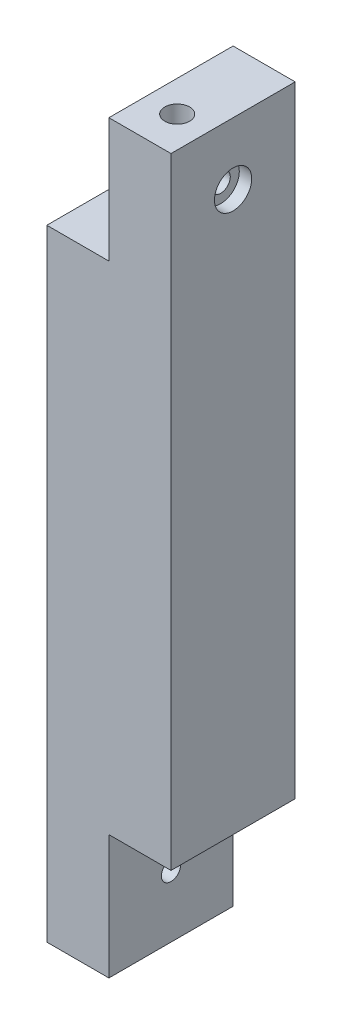
ISO-10303-21;
HEADER;
FILE_DESCRIPTION(('STEP AP214'),'2;1');
FILE_NAME('part.step','',(''),(''),'','','');
FILE_SCHEMA(('AUTOMOTIVE_DESIGN { 1 0 10303 214 1 1 1 1 }'));
ENDSEC;
DATA;
#1=APPLICATION_CONTEXT('core data for automotive mechanical design processes');
#2=APPLICATION_PROTOCOL_DEFINITION('international standard','automotive_design',2000,#1);
#3=PRODUCT_CONTEXT('',#1,'mechanical');
#4=PRODUCT('Part','Part','',(#3));
#5=PRODUCT_RELATED_PRODUCT_CATEGORY('part','',(#4));
#6=PRODUCT_DEFINITION_FORMATION('','',#4);
#7=PRODUCT_DEFINITION_CONTEXT('part definition',#1,'design');
#8=PRODUCT_DEFINITION('design','',#6,#7);
#9=PRODUCT_DEFINITION_SHAPE('','',#8);
#10=(LENGTH_UNIT() NAMED_UNIT(*) SI_UNIT(.MILLI.,.METRE.));
#11=(NAMED_UNIT(*) PLANE_ANGLE_UNIT() SI_UNIT($,.RADIAN.));
#12=(NAMED_UNIT(*) SI_UNIT($,.STERADIAN.) SOLID_ANGLE_UNIT());
#13=UNCERTAINTY_MEASURE_WITH_UNIT(LENGTH_MEASURE(1.E-05),#10,'distance_accuracy_value','');
#14=(GEOMETRIC_REPRESENTATION_CONTEXT(3) GLOBAL_UNCERTAINTY_ASSIGNED_CONTEXT((#13)) GLOBAL_UNIT_ASSIGNED_CONTEXT((#10,
#11,#12)) REPRESENTATION_CONTEXT('',''));
#15=CARTESIAN_POINT('',(0.,0.,0.));
#16=DIRECTION('',(0.,0.,1.));
#17=DIRECTION('',(1.,0.,0.));
#18=AXIS2_PLACEMENT_3D('',#15,#16,#17);
#19=CARTESIAN_POINT('',(-27.9813215779807,10.,6.45386967852447));
#20=DIRECTION('',(1.,0.,0.));
#21=DIRECTION('',(0.,0.,-1.));
#22=AXIS2_PLACEMENT_3D('',#19,#20,#21);
#23=CYLINDRICAL_SURFACE('',#22,1.55);
#24=CARTESIAN_POINT('',(-7.98132157798069,10.,6.45386967852447));
#25=DIRECTION('',(1.,0.,0.));
#26=DIRECTION('',(0.,0.,-1.));
#27=AXIS2_PLACEMENT_3D('',#24,#25,#26);
#28=CIRCLE('',#27,1.55);
#29=CARTESIAN_POINT('',(-7.98132157798069,10.,4.90386967852447));
#30=VERTEX_POINT('',#29);
#31=EDGE_CURVE('E218',#30,#30,#28,.T.);
#32=ORIENTED_EDGE('',*,*,#31,.T.);
#33=EDGE_LOOP('',(#32));
#34=FACE_BOUND('',#33,.T.);
#35=CARTESIAN_POINT('',(-15.9813215779807,10.,6.45386967852447));
#36=DIRECTION('',(-1.,0.,0.));
#37=DIRECTION('',(0.,0.,1.));
#38=AXIS2_PLACEMENT_3D('',#35,#36,#37);
#39=CIRCLE('',#38,1.55);
#40=CARTESIAN_POINT('',(-15.9813215779807,10.,8.00386967852447));
#41=VERTEX_POINT('',#40);
#42=EDGE_CURVE('E54',#41,#41,#39,.F.);
#43=ORIENTED_EDGE('',*,*,#42,.F.);
#44=EDGE_LOOP('',(#43));
#45=FACE_BOUND('',#44,.T.);
#46=ADVANCED_FACE('F50',(#34,#45),#23,.F.);
#47=CARTESIAN_POINT('',(112.018678422019,110.,6.45386967852447));
#48=DIRECTION('',(-1.,0.,0.));
#49=DIRECTION('',(0.,-1.,0.));
#50=AXIS2_PLACEMENT_3D('',#47,#48,#49);
#51=CYLINDRICAL_SURFACE('',#50,1.55);
#52=CARTESIAN_POINT('',(-7.98132157798068,110.,6.45386967852447));
#53=DIRECTION('',(-1.,0.,0.));
#54=DIRECTION('',(0.,-1.,0.));
#55=AXIS2_PLACEMENT_3D('',#52,#53,#54);
#56=CIRCLE('',#55,1.55);
#57=CARTESIAN_POINT('',(-7.98132157798068,108.45,6.45386967852447));
#58=VERTEX_POINT('',#57);
#59=EDGE_CURVE('E133',#58,#58,#56,.T.);
#60=ORIENTED_EDGE('',*,*,#59,.T.);
#61=EDGE_LOOP('',(#60));
#62=FACE_BOUND('',#61,.T.);
#63=CARTESIAN_POINT('',(0.0186784220193165,110.,6.45386967852447));
#64=DIRECTION('',(1.,0.,0.));
#65=DIRECTION('',(0.,0.,-1.));
#66=AXIS2_PLACEMENT_3D('',#63,#64,#65);
#67=CIRCLE('',#66,1.55);
#68=CARTESIAN_POINT('',(0.0186784220193162,110.,4.90386967852447));
#69=VERTEX_POINT('',#68);
#70=EDGE_CURVE('E202',#69,#69,#67,.F.);
#71=ORIENTED_EDGE('',*,*,#70,.F.);
#72=EDGE_LOOP('',(#71));
#73=FACE_BOUND('',#72,.T.);
#74=ADVANCED_FACE('F265',(#62,#73),#51,.F.);
#75=CARTESIAN_POINT('',(0.,0.,0.));
#76=DIRECTION('',(0.,-1.,0.));
#77=DIRECTION('',(0.,0.,-1.));
#78=AXIS2_PLACEMENT_3D('',#75,#76,#77);
#79=PLANE('',#78);
#80=DIRECTION('',(1.,0.,0.));
#81=VECTOR('',#80,1.);
#82=CARTESIAN_POINT('',(-17.9813215779807,0.,-3.54613032147553));
#83=LINE('',#82,#81);
#84=CARTESIAN_POINT('',(-17.9813215779807,0.,-3.54613032147553));
#85=VERTEX_POINT('',#84);
#86=CARTESIAN_POINT('',(-7.98132157798069,0.,-3.54613032147554));
#87=VERTEX_POINT('',#86);
#88=EDGE_CURVE('E179',#85,#87,#83,.T.);
#89=ORIENTED_EDGE('',*,*,#88,.T.);
#90=DIRECTION('',(0.,0.,1.));
#91=VECTOR('',#90,1.);
#92=CARTESIAN_POINT('',(-7.98132157798069,0.,0.));
#93=LINE('',#92,#91);
#94=CARTESIAN_POINT('',(-7.98132157798069,0.,16.4538696785245));
#95=VERTEX_POINT('',#94);
#96=EDGE_CURVE('E60',#87,#95,#93,.T.);
#97=ORIENTED_EDGE('',*,*,#96,.T.);
#98=DIRECTION('',(1.,0.,0.));
#99=VECTOR('',#98,1.);
#100=CARTESIAN_POINT('',(-17.9813215779807,0.,16.4538696785245));
#101=LINE('',#100,#99);
#102=CARTESIAN_POINT('',(-17.9813215779807,0.,16.4538696785245));
#103=VERTEX_POINT('',#102);
#104=EDGE_CURVE('E137',#103,#95,#101,.T.);
#105=ORIENTED_EDGE('',*,*,#104,.F.);
#106=DIRECTION('',(0.,0.,1.));
#107=VECTOR('',#106,1.);
#108=CARTESIAN_POINT('',(-17.9813215779807,0.,-3.54613032147553));
#109=LINE('',#108,#107);
#110=EDGE_CURVE('E169',#85,#103,#109,.T.);
#111=ORIENTED_EDGE('',*,*,#110,.F.);
#112=EDGE_LOOP('',(#89,#97,#105,#111));
#113=FACE_BOUND('',#112,.T.);
#114=ADVANCED_FACE('F271',(#113),#79,.T.);
#115=CARTESIAN_POINT('',(0.,120.,0.));
#116=DIRECTION('',(0.,-1.,0.));
#117=DIRECTION('',(0.,0.,-1.));
#118=AXIS2_PLACEMENT_3D('',#115,#116,#117);
#119=PLANE('',#118);
#120=CARTESIAN_POINT('',(-2.98132157798069,120.,10.4538696785245));
#121=DIRECTION('',(0.,-1.,0.));
#122=DIRECTION('',(0.,0.,-1.));
#123=AXIS2_PLACEMENT_3D('',#120,#121,#122);
#124=CIRCLE('',#123,2.);
#125=CARTESIAN_POINT('',(-2.98132157798069,120.,8.45386967852447));
#126=VERTEX_POINT('',#125);
#127=EDGE_CURVE('E229',#126,#126,#124,.T.);
#128=ORIENTED_EDGE('',*,*,#127,.T.);
#129=EDGE_LOOP('',(#128));
#130=FACE_BOUND('',#129,.T.);
#131=DIRECTION('',(0.,0.,-1.));
#132=VECTOR('',#131,1.);
#133=CARTESIAN_POINT('',(-7.98132157798069,120.,0.));
#134=LINE('',#133,#132);
#135=CARTESIAN_POINT('',(-7.98132157798068,120.,16.4538696785245));
#136=VERTEX_POINT('',#135);
#137=CARTESIAN_POINT('',(-7.98132157798069,120.,-3.54613032147554));
#138=VERTEX_POINT('',#137);
#139=EDGE_CURVE('E198',#136,#138,#134,.T.);
#140=ORIENTED_EDGE('',*,*,#139,.F.);
#141=DIRECTION('',(1.,0.,0.));
#142=VECTOR('',#141,1.);
#143=CARTESIAN_POINT('',(-17.9813215779807,120.,16.4538696785245));
#144=LINE('',#143,#142);
#145=CARTESIAN_POINT('',(2.01867842201931,120.,16.4538696785245));
#146=VERTEX_POINT('',#145);
#147=EDGE_CURVE('E165',#136,#146,#144,.T.);
#148=ORIENTED_EDGE('',*,*,#147,.T.);
#149=DIRECTION('',(0.,0.,1.));
#150=VECTOR('',#149,1.);
#151=CARTESIAN_POINT('',(2.01867842201931,120.,-3.54613032147553));
#152=LINE('',#151,#150);
#153=CARTESIAN_POINT('',(2.01867842201931,120.,-3.54613032147553));
#154=VERTEX_POINT('',#153);
#155=EDGE_CURVE('E168',#154,#146,#152,.T.);
#156=ORIENTED_EDGE('',*,*,#155,.F.);
#157=DIRECTION('',(1.,0.,0.));
#158=VECTOR('',#157,1.);
#159=CARTESIAN_POINT('',(-17.9813215779807,120.,-3.54613032147553));
#160=LINE('',#159,#158);
#161=EDGE_CURVE('E173',#138,#154,#160,.T.);
#162=ORIENTED_EDGE('',*,*,#161,.F.);
#163=EDGE_LOOP('',(#140,#148,#156,#162));
#164=FACE_BOUND('',#163,.T.);
#165=ADVANCED_FACE('F241',(#130,#164),#119,.F.);
#166=CARTESIAN_POINT('',(-17.9813215779807,120.,16.4538696785245));
#167=DIRECTION('',(0.,0.,-1.));
#168=DIRECTION('',(-1.,0.,0.));
#169=AXIS2_PLACEMENT_3D('',#166,#167,#168);
#170=PLANE('',#169);
#171=DIRECTION('',(0.,1.,0.));
#172=VECTOR('',#171,1.);
#173=CARTESIAN_POINT('',(-7.98132157798069,0.,16.4538696785245));
#174=LINE('',#173,#172);
#175=CARTESIAN_POINT('',(-7.98132157798069,20.,16.4538696785245));
#176=VERTEX_POINT('',#175);
#177=EDGE_CURVE('E68',#95,#176,#174,.T.);
#178=ORIENTED_EDGE('',*,*,#177,.T.);
#179=DIRECTION('',(-1.,0.,0.));
#180=VECTOR('',#179,1.);
#181=CARTESIAN_POINT('',(2.01867842201931,20.,16.4538696785245));
#182=LINE('',#181,#180);
#183=CARTESIAN_POINT('',(2.01867842201931,20.,16.4538696785245));
#184=VERTEX_POINT('',#183);
#185=EDGE_CURVE('E126',#184,#176,#182,.T.);
#186=ORIENTED_EDGE('',*,*,#185,.F.);
#187=DIRECTION('',(0.,-1.,0.));
#188=VECTOR('',#187,1.);
#189=CARTESIAN_POINT('',(2.01867842201931,120.,16.4538696785245));
#190=LINE('',#189,#188);
#191=EDGE_CURVE('E195',#146,#184,#190,.T.);
#192=ORIENTED_EDGE('',*,*,#191,.F.);
#193=ORIENTED_EDGE('',*,*,#147,.F.);
#194=DIRECTION('',(0.,-1.,0.));
#195=VECTOR('',#194,1.);
#196=CARTESIAN_POINT('',(-7.98132157798069,120.,16.4538696785245));
#197=LINE('',#196,#195);
#198=CARTESIAN_POINT('',(-7.98132157798068,100.,16.4538696785245));
#199=VERTEX_POINT('',#198);
#200=EDGE_CURVE('E76',#136,#199,#197,.T.);
#201=ORIENTED_EDGE('',*,*,#200,.T.);
#202=DIRECTION('',(1.,0.,0.));
#203=VECTOR('',#202,1.);
#204=CARTESIAN_POINT('',(-17.9813215779807,100.,16.4538696785245));
#205=LINE('',#204,#203);
#206=CARTESIAN_POINT('',(-17.9813215779807,100.,16.4538696785245));
#207=VERTEX_POINT('',#206);
#208=EDGE_CURVE('E146',#207,#199,#205,.T.);
#209=ORIENTED_EDGE('',*,*,#208,.F.);
#210=DIRECTION('',(0.,-1.,0.));
#211=VECTOR('',#210,1.);
#212=CARTESIAN_POINT('',(-17.9813215779807,120.,16.4538696785245));
#213=LINE('',#212,#211);
#214=EDGE_CURVE('E176',#207,#103,#213,.T.);
#215=ORIENTED_EDGE('',*,*,#214,.T.);
#216=ORIENTED_EDGE('',*,*,#104,.T.);
#217=EDGE_LOOP('',(#178,#186,#192,#193,#201,#209,#215,#216));
#218=FACE_BOUND('',#217,.T.);
#219=ADVANCED_FACE('F52',(#218),#170,.F.);
#220=CARTESIAN_POINT('',(2.01867842201931,120.,-3.54613032147553));
#221=DIRECTION('',(1.,0.,0.));
#222=DIRECTION('',(0.,0.,-1.));
#223=AXIS2_PLACEMENT_3D('',#220,#221,#222);
#224=PLANE('',#223);
#225=CARTESIAN_POINT('',(2.01867842201931,110.,6.45386967852447));
#226=DIRECTION('',(1.,0.,0.));
#227=DIRECTION('',(0.,0.,-1.));
#228=AXIS2_PLACEMENT_3D('',#225,#226,#227);
#229=CIRCLE('',#228,3.);
#230=CARTESIAN_POINT('',(2.01867842201931,110.,3.45386967852447));
#231=VERTEX_POINT('',#230);
#232=EDGE_CURVE('E212',#231,#231,#229,.T.);
#233=ORIENTED_EDGE('',*,*,#232,.F.);
#234=EDGE_LOOP('',(#233));
#235=FACE_BOUND('',#234,.T.);
#236=DIRECTION('',(0.,0.,1.));
#237=VECTOR('',#236,1.);
#238=CARTESIAN_POINT('',(2.01867842201931,20.,-103.546130321476));
#239=LINE('',#238,#237);
#240=CARTESIAN_POINT('',(2.01867842201931,20.,-3.54613032147554));
#241=VERTEX_POINT('',#240);
#242=EDGE_CURVE('E123',#241,#184,#239,.T.);
#243=ORIENTED_EDGE('',*,*,#242,.F.);
#244=DIRECTION('',(0.,-1.,0.));
#245=VECTOR('',#244,1.);
#246=CARTESIAN_POINT('',(2.01867842201931,120.,-3.54613032147553));
#247=LINE('',#246,#245);
#248=EDGE_CURVE('E191',#154,#241,#247,.T.);
#249=ORIENTED_EDGE('',*,*,#248,.F.);
#250=ORIENTED_EDGE('',*,*,#155,.T.);
#251=ORIENTED_EDGE('',*,*,#191,.T.);
#252=EDGE_LOOP('',(#243,#249,#250,#251));
#253=FACE_BOUND('',#252,.T.);
#254=ADVANCED_FACE('F291',(#235,#253),#224,.T.);
#255=CARTESIAN_POINT('',(-17.9813215779807,120.,-3.54613032147553));
#256=DIRECTION('',(0.,0.,-1.));
#257=DIRECTION('',(-1.,0.,0.));
#258=AXIS2_PLACEMENT_3D('',#255,#256,#257);
#259=PLANE('',#258);
#260=DIRECTION('',(1.,0.,0.));
#261=VECTOR('',#260,1.);
#262=CARTESIAN_POINT('',(-17.9813215779807,20.,-3.54613032147553));
#263=LINE('',#262,#261);
#264=CARTESIAN_POINT('',(-7.98132157798069,20.,-3.54613032147554));
#265=VERTEX_POINT('',#264);
#266=EDGE_CURVE('E12',#265,#241,#263,.T.);
#267=ORIENTED_EDGE('',*,*,#266,.F.);
#268=DIRECTION('',(0.,-1.,0.));
#269=VECTOR('',#268,1.);
#270=CARTESIAN_POINT('',(-7.98132157798069,120.,-3.54613032147553));
#271=LINE('',#270,#269);
#272=EDGE_CURVE('E119',#265,#87,#271,.T.);
#273=ORIENTED_EDGE('',*,*,#272,.T.);
#274=ORIENTED_EDGE('',*,*,#88,.F.);
#275=DIRECTION('',(0.,-1.,0.));
#276=VECTOR('',#275,1.);
#277=CARTESIAN_POINT('',(-17.9813215779807,120.,-3.54613032147553));
#278=LINE('',#277,#276);
#279=CARTESIAN_POINT('',(-17.9813215779807,100.,-3.54613032147554));
#280=VERTEX_POINT('',#279);
#281=EDGE_CURVE('E188',#280,#85,#278,.T.);
#282=ORIENTED_EDGE('',*,*,#281,.F.);
#283=DIRECTION('',(-1.,0.,0.));
#284=VECTOR('',#283,1.);
#285=CARTESIAN_POINT('',(-17.9813215779807,100.,-3.54613032147553));
#286=LINE('',#285,#284);
#287=CARTESIAN_POINT('',(-7.98132157798068,100.,-3.54613032147554));
#288=VERTEX_POINT('',#287);
#289=EDGE_CURVE('E162',#288,#280,#286,.T.);
#290=ORIENTED_EDGE('',*,*,#289,.F.);
#291=DIRECTION('',(0.,1.,0.));
#292=VECTOR('',#291,1.);
#293=CARTESIAN_POINT('',(-7.98132157798069,120.,-3.54613032147553));
#294=LINE('',#293,#292);
#295=EDGE_CURVE('E156',#288,#138,#294,.T.);
#296=ORIENTED_EDGE('',*,*,#295,.T.);
#297=ORIENTED_EDGE('',*,*,#161,.T.);
#298=ORIENTED_EDGE('',*,*,#248,.T.);
#299=EDGE_LOOP('',(#267,#273,#274,#282,#290,#296,#297,#298));
#300=FACE_BOUND('',#299,.T.);
#301=ADVANCED_FACE('F294',(#300),#259,.T.);
#302=CARTESIAN_POINT('',(-17.9813215779807,120.,-3.54613032147553));
#303=DIRECTION('',(1.,0.,0.));
#304=DIRECTION('',(0.,0.,-1.));
#305=AXIS2_PLACEMENT_3D('',#302,#303,#304);
#306=PLANE('',#305);
#307=CARTESIAN_POINT('',(-17.9813215779807,10.,6.45386967852447));
#308=DIRECTION('',(-1.,0.,0.));
#309=DIRECTION('',(0.,0.,1.));
#310=AXIS2_PLACEMENT_3D('',#307,#308,#309);
#311=CIRCLE('',#310,3.);
#312=CARTESIAN_POINT('',(-17.9813215779807,10.,9.45386967852447));
#313=VERTEX_POINT('',#312);
#314=EDGE_CURVE('E224',#313,#313,#311,.T.);
#315=ORIENTED_EDGE('',*,*,#314,.F.);
#316=EDGE_LOOP('',(#315));
#317=FACE_BOUND('',#316,.T.);
#318=ORIENTED_EDGE('',*,*,#214,.F.);
#319=DIRECTION('',(0.,0.,1.));
#320=VECTOR('',#319,1.);
#321=CARTESIAN_POINT('',(-17.9813215779807,100.,-103.546130321476));
#322=LINE('',#321,#320);
#323=EDGE_CURVE('E153',#280,#207,#322,.T.);
#324=ORIENTED_EDGE('',*,*,#323,.F.);
#325=ORIENTED_EDGE('',*,*,#281,.T.);
#326=ORIENTED_EDGE('',*,*,#110,.T.);
#327=EDGE_LOOP('',(#318,#324,#325,#326));
#328=FACE_BOUND('',#327,.T.);
#329=ADVANCED_FACE('F307',(#317,#328),#306,.F.);
#330=CARTESIAN_POINT('',(-17.9813215779807,100.,-103.546130321476));
#331=DIRECTION('',(0.,-1.,0.));
#332=DIRECTION('',(0.,0.,-1.));
#333=AXIS2_PLACEMENT_3D('',#330,#331,#332);
#334=PLANE('',#333);
#335=ORIENTED_EDGE('',*,*,#289,.T.);
#336=ORIENTED_EDGE('',*,*,#323,.T.);
#337=ORIENTED_EDGE('',*,*,#208,.T.);
#338=DIRECTION('',(0.,0.,1.));
#339=VECTOR('',#338,1.);
#340=CARTESIAN_POINT('',(-7.98132157798068,100.,-103.546130321476));
#341=LINE('',#340,#339);
#342=EDGE_CURVE('E152',#288,#199,#341,.T.);
#343=ORIENTED_EDGE('',*,*,#342,.F.);
#344=EDGE_LOOP('',(#335,#336,#337,#343));
#345=FACE_BOUND('',#344,.T.);
#346=ADVANCED_FACE('F261',(#345),#334,.F.);
#347=CARTESIAN_POINT('',(-7.98132157798069,120.,-103.546130321476));
#348=DIRECTION('',(-1.,0.,0.));
#349=DIRECTION('',(0.,-1.,0.));
#350=AXIS2_PLACEMENT_3D('',#347,#348,#349);
#351=PLANE('',#350);
#352=ORIENTED_EDGE('',*,*,#59,.F.);
#353=EDGE_LOOP('',(#352));
#354=FACE_BOUND('',#353,.T.);
#355=ORIENTED_EDGE('',*,*,#342,.T.);
#356=ORIENTED_EDGE('',*,*,#200,.F.);
#357=ORIENTED_EDGE('',*,*,#139,.T.);
#358=ORIENTED_EDGE('',*,*,#295,.F.);
#359=EDGE_LOOP('',(#355,#356,#357,#358));
#360=FACE_BOUND('',#359,.T.);
#361=ADVANCED_FACE('F252',(#354,#360),#351,.T.);
#362=CARTESIAN_POINT('',(2.01867842201931,20.,-103.546130321476));
#363=DIRECTION('',(0.,1.,0.));
#364=DIRECTION('',(0.,0.,1.));
#365=AXIS2_PLACEMENT_3D('',#362,#363,#364);
#366=PLANE('',#365);
#367=CARTESIAN_POINT('',(-2.98132157798069,20.,10.4538696785245));
#368=DIRECTION('',(0.,-1.,0.));
#369=DIRECTION('',(0.,0.,-1.));
#370=AXIS2_PLACEMENT_3D('',#367,#368,#369);
#371=CIRCLE('',#370,2.);
#372=CARTESIAN_POINT('',(-2.98132157798069,20.,8.45386967852447));
#373=VERTEX_POINT('',#372);
#374=EDGE_CURVE('E233',#373,#373,#371,.T.);
#375=ORIENTED_EDGE('',*,*,#374,.F.);
#376=EDGE_LOOP('',(#375));
#377=FACE_BOUND('',#376,.T.);
#378=ORIENTED_EDGE('',*,*,#266,.T.);
#379=ORIENTED_EDGE('',*,*,#242,.T.);
#380=ORIENTED_EDGE('',*,*,#185,.T.);
#381=DIRECTION('',(0.,0.,1.));
#382=VECTOR('',#381,1.);
#383=CARTESIAN_POINT('',(-7.98132157798069,20.,-103.546130321476));
#384=LINE('',#383,#382);
#385=EDGE_CURVE('E115',#265,#176,#384,.T.);
#386=ORIENTED_EDGE('',*,*,#385,.F.);
#387=EDGE_LOOP('',(#378,#379,#380,#386));
#388=FACE_BOUND('',#387,.T.);
#389=ADVANCED_FACE('F127',(#377,#388),#366,.F.);
#390=CARTESIAN_POINT('',(-7.98132157798069,0.,-103.546130321476));
#391=DIRECTION('',(1.,0.,0.));
#392=DIRECTION('',(0.,0.,-1.));
#393=AXIS2_PLACEMENT_3D('',#390,#391,#392);
#394=PLANE('',#393);
#395=ORIENTED_EDGE('',*,*,#31,.F.);
#396=EDGE_LOOP('',(#395));
#397=FACE_BOUND('',#396,.T.);
#398=ORIENTED_EDGE('',*,*,#385,.T.);
#399=ORIENTED_EDGE('',*,*,#177,.F.);
#400=ORIENTED_EDGE('',*,*,#96,.F.);
#401=ORIENTED_EDGE('',*,*,#272,.F.);
#402=EDGE_LOOP('',(#398,#399,#400,#401));
#403=FACE_BOUND('',#402,.T.);
#404=ADVANCED_FACE('F117',(#397,#403),#394,.T.);
#405=CARTESIAN_POINT('',(0.018678422019313,110.,6.45386967852447));
#406=DIRECTION('',(1.,0.,0.));
#407=DIRECTION('',(0.,0.,-1.));
#408=AXIS2_PLACEMENT_3D('',#405,#406,#407);
#409=PLANE('',#408);
#410=CARTESIAN_POINT('',(0.018678422019313,110.,6.45386967852447));
#411=DIRECTION('',(1.,0.,0.));
#412=DIRECTION('',(0.,0.,-1.));
#413=AXIS2_PLACEMENT_3D('',#410,#411,#412);
#414=CIRCLE('',#413,3.);
#415=CARTESIAN_POINT('',(0.0186784220193125,110.,3.45386967852447));
#416=VERTEX_POINT('',#415);
#417=EDGE_CURVE('E205',#416,#416,#414,.T.);
#418=ORIENTED_EDGE('',*,*,#417,.T.);
#419=EDGE_LOOP('',(#418));
#420=FACE_BOUND('',#419,.T.);
#421=ORIENTED_EDGE('',*,*,#70,.T.);
#422=EDGE_LOOP('',(#421));
#423=FACE_BOUND('',#422,.T.);
#424=ADVANCED_FACE('F258',(#420,#423),#409,.T.);
#425=CARTESIAN_POINT('',(0.018678422019313,110.,6.45386967852447));
#426=DIRECTION('',(1.,0.,0.));
#427=DIRECTION('',(0.,0.,-1.));
#428=AXIS2_PLACEMENT_3D('',#425,#426,#427);
#429=CYLINDRICAL_SURFACE('',#428,3.);
#430=ORIENTED_EDGE('',*,*,#417,.F.);
#431=EDGE_LOOP('',(#430));
#432=FACE_BOUND('',#431,.T.);
#433=ORIENTED_EDGE('',*,*,#232,.T.);
#434=EDGE_LOOP('',(#433));
#435=FACE_BOUND('',#434,.T.);
#436=ADVANCED_FACE('F280',(#432,#435),#429,.F.);
#437=CARTESIAN_POINT('',(-15.9813215779807,10.,6.45386967852447));
#438=DIRECTION('',(-1.,0.,0.));
#439=DIRECTION('',(0.,0.,1.));
#440=AXIS2_PLACEMENT_3D('',#437,#438,#439);
#441=PLANE('',#440);
#442=CARTESIAN_POINT('',(-15.9813215779807,10.,6.45386967852447));
#443=DIRECTION('',(-1.,0.,0.));
#444=DIRECTION('',(0.,0.,1.));
#445=AXIS2_PLACEMENT_3D('',#442,#443,#444);
#446=CIRCLE('',#445,3.);
#447=CARTESIAN_POINT('',(-15.9813215779807,10.,9.45386967852447));
#448=VERTEX_POINT('',#447);
#449=EDGE_CURVE('E228',#448,#448,#446,.T.);
#450=ORIENTED_EDGE('',*,*,#449,.T.);
#451=EDGE_LOOP('',(#450));
#452=FACE_BOUND('',#451,.T.);
#453=ORIENTED_EDGE('',*,*,#42,.T.);
#454=EDGE_LOOP('',(#453));
#455=FACE_BOUND('',#454,.T.);
#456=ADVANCED_FACE('F282',(#452,#455),#441,.T.);
#457=CARTESIAN_POINT('',(-15.9813215779807,10.,6.45386967852447));
#458=DIRECTION('',(-1.,0.,0.));
#459=DIRECTION('',(0.,0.,1.));
#460=AXIS2_PLACEMENT_3D('',#457,#458,#459);
#461=CYLINDRICAL_SURFACE('',#460,3.);
#462=ORIENTED_EDGE('',*,*,#449,.F.);
#463=EDGE_LOOP('',(#462));
#464=FACE_BOUND('',#463,.T.);
#465=ORIENTED_EDGE('',*,*,#314,.T.);
#466=EDGE_LOOP('',(#465));
#467=FACE_BOUND('',#466,.T.);
#468=ADVANCED_FACE('F247',(#464,#467),#461,.F.);
#469=CARTESIAN_POINT('',(-2.98132157798069,120.,10.4538696785245));
#470=DIRECTION('',(0.,-1.,0.));
#471=DIRECTION('',(0.,0.,-1.));
#472=AXIS2_PLACEMENT_3D('',#469,#470,#471);
#473=CYLINDRICAL_SURFACE('',#472,2.);
#474=ORIENTED_EDGE('',*,*,#127,.F.);
#475=EDGE_LOOP('',(#474));
#476=FACE_BOUND('',#475,.T.);
#477=ORIENTED_EDGE('',*,*,#374,.T.);
#478=EDGE_LOOP('',(#477));
#479=FACE_BOUND('',#478,.T.);
#480=ADVANCED_FACE('F244',(#476,#479),#473,.F.);
#481=CLOSED_SHELL('',(#46,#74,#114,#165,#219,#254,#301,#329,#346,#361,#389,#404,#424,#436,#456,
#468,#480));
#482=MANIFOLD_SOLID_BREP('B2',#481);
#483=ADVANCED_BREP_SHAPE_REPRESENTATION('',(#18,#482),#14);
#484=SHAPE_DEFINITION_REPRESENTATION(#9,#483);
ENDSEC;
END-ISO-10303-21;
